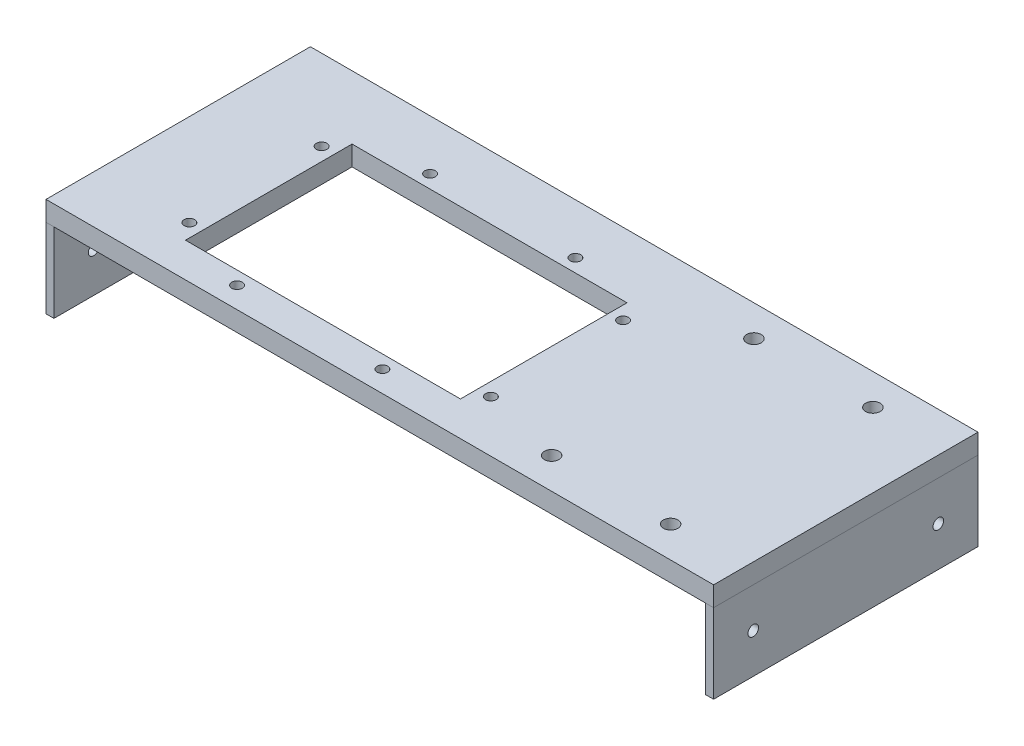
ISO-10303-21;
HEADER;
FILE_DESCRIPTION(('STEP AP214'),'2;1');
FILE_NAME('part.step','',(''),(''),'','','');
FILE_SCHEMA(('AUTOMOTIVE_DESIGN { 1 0 10303 214 1 1 1 1 }'));
ENDSEC;
DATA;
#1=APPLICATION_CONTEXT('core data for automotive mechanical design processes');
#2=APPLICATION_PROTOCOL_DEFINITION('international standard','automotive_design',2000,#1);
#3=PRODUCT_CONTEXT('',#1,'mechanical');
#4=PRODUCT('Part','Part','',(#3));
#5=PRODUCT_RELATED_PRODUCT_CATEGORY('part','',(#4));
#6=PRODUCT_DEFINITION_FORMATION('','',#4);
#7=PRODUCT_DEFINITION_CONTEXT('part definition',#1,'design');
#8=PRODUCT_DEFINITION('design','',#6,#7);
#9=PRODUCT_DEFINITION_SHAPE('','',#8);
#10=(LENGTH_UNIT() NAMED_UNIT(*) SI_UNIT(.MILLI.,.METRE.));
#11=(NAMED_UNIT(*) PLANE_ANGLE_UNIT() SI_UNIT($,.RADIAN.));
#12=(NAMED_UNIT(*) SI_UNIT($,.STERADIAN.) SOLID_ANGLE_UNIT());
#13=UNCERTAINTY_MEASURE_WITH_UNIT(LENGTH_MEASURE(1.E-05),#10,'distance_accuracy_value','');
#14=(GEOMETRIC_REPRESENTATION_CONTEXT(3) GLOBAL_UNCERTAINTY_ASSIGNED_CONTEXT((#13)) GLOBAL_UNIT_ASSIGNED_CONTEXT((#10,
#11,#12)) REPRESENTATION_CONTEXT('',''));
#15=CARTESIAN_POINT('',(0.,0.,0.));
#16=DIRECTION('',(0.,0.,1.));
#17=DIRECTION('',(1.,0.,0.));
#18=AXIS2_PLACEMENT_3D('',#15,#16,#17);
#19=CARTESIAN_POINT('',(252.5,-14.9999999999999,-100.000000000001));
#20=DIRECTION('',(0.,1.,0.));
#21=DIRECTION('',(-1.,0.,0.));
#22=AXIS2_PLACEMENT_3D('',#19,#20,#21);
#23=PLANE('',#22);
#24=DIRECTION('',(-1.,0.,0.));
#25=VECTOR('',#24,1.);
#26=CARTESIAN_POINT('',(252.5,-14.9999999999999,100.000000000001));
#27=LINE('',#26,#25);
#28=CARTESIAN_POINT('',(252.5,-14.9999999999999,100.000000000001));
#29=VERTEX_POINT('',#28);
#30=CARTESIAN_POINT('',(246.5,-14.9999999999999,100.000000000001));
#31=VERTEX_POINT('',#30);
#32=EDGE_CURVE('E113',#29,#31,#27,.T.);
#33=ORIENTED_EDGE('',*,*,#32,.F.);
#34=DIRECTION('',(0.,0.,1.));
#35=VECTOR('',#34,1.);
#36=CARTESIAN_POINT('',(252.5,-14.9999999999999,-100.000000000001));
#37=LINE('',#36,#35);
#38=CARTESIAN_POINT('',(252.5,-14.9999999999999,-100.000000000001));
#39=VERTEX_POINT('',#38);
#40=EDGE_CURVE('E12',#39,#29,#37,.T.);
#41=ORIENTED_EDGE('',*,*,#40,.F.);
#42=DIRECTION('',(-1.,0.,0.));
#43=VECTOR('',#42,1.);
#44=CARTESIAN_POINT('',(252.5,-14.9999999999999,-100.000000000001));
#45=LINE('',#44,#43);
#46=CARTESIAN_POINT('',(246.5,-14.9999999999999,-100.000000000001));
#47=VERTEX_POINT('',#46);
#48=EDGE_CURVE('E106',#39,#47,#45,.T.);
#49=ORIENTED_EDGE('',*,*,#48,.T.);
#50=DIRECTION('',(0.,0.,1.));
#51=VECTOR('',#50,1.);
#52=CARTESIAN_POINT('',(246.5,-14.9999999999999,-100.000000000001));
#53=LINE('',#52,#51);
#54=EDGE_CURVE('E89',#47,#31,#53,.T.);
#55=ORIENTED_EDGE('',*,*,#54,.T.);
#56=EDGE_LOOP('',(#33,#41,#49,#55));
#57=FACE_BOUND('',#56,.T.);
#58=ADVANCED_FACE('F46',(#57),#23,.T.);
#59=CARTESIAN_POINT('',(252.5,-14.9999999999999,-100.000000000001));
#60=DIRECTION('',(1.,0.,0.));
#61=DIRECTION('',(0.,0.,-1.));
#62=AXIS2_PLACEMENT_3D('',#59,#60,#61);
#63=PLANE('',#62);
#64=CARTESIAN_POINT('',(252.5,-45.,70.0000000000006));
#65=DIRECTION('',(-1.,0.,0.));
#66=DIRECTION('',(0.,0.,1.));
#67=AXIS2_PLACEMENT_3D('',#64,#65,#66);
#68=CIRCLE('',#67,4.00000000000001);
#69=CARTESIAN_POINT('',(252.5,-45.,74.0000000000007));
#70=VERTEX_POINT('',#69);
#71=EDGE_CURVE('E124',#70,#70,#68,.T.);
#72=ORIENTED_EDGE('',*,*,#71,.T.);
#73=EDGE_LOOP('',(#72));
#74=FACE_BOUND('',#73,.T.);
#75=CARTESIAN_POINT('',(252.5,-45.,-70.0000000000006));
#76=DIRECTION('',(-1.,0.,0.));
#77=DIRECTION('',(0.,0.,-1.));
#78=AXIS2_PLACEMENT_3D('',#75,#76,#77);
#79=CIRCLE('',#78,4.00000000000001);
#80=CARTESIAN_POINT('',(252.5,-45.,-74.0000000000007));
#81=VERTEX_POINT('',#80);
#82=EDGE_CURVE('E129',#81,#81,#79,.T.);
#83=ORIENTED_EDGE('',*,*,#82,.T.);
#84=EDGE_LOOP('',(#83));
#85=FACE_BOUND('',#84,.T.);
#86=DIRECTION('',(0.,1.,0.));
#87=VECTOR('',#86,1.);
#88=CARTESIAN_POINT('',(252.5,-14.9999999999999,100.000000000001));
#89=LINE('',#88,#87);
#90=CARTESIAN_POINT('',(252.5,-74.9999999999999,100.000000000001));
#91=VERTEX_POINT('',#90);
#92=EDGE_CURVE('E108',#91,#29,#89,.T.);
#93=ORIENTED_EDGE('',*,*,#92,.F.);
#94=DIRECTION('',(0.,0.,1.));
#95=VECTOR('',#94,1.);
#96=CARTESIAN_POINT('',(252.5,-74.9999999999999,-100.000000000001));
#97=LINE('',#96,#95);
#98=CARTESIAN_POINT('',(252.5,-74.9999999999999,-100.000000000001));
#99=VERTEX_POINT('',#98);
#100=EDGE_CURVE('E55',#99,#91,#97,.T.);
#101=ORIENTED_EDGE('',*,*,#100,.F.);
#102=DIRECTION('',(0.,1.,0.));
#103=VECTOR('',#102,1.);
#104=CARTESIAN_POINT('',(252.5,-14.9999999999999,-100.000000000001));
#105=LINE('',#104,#103);
#106=EDGE_CURVE('E103',#99,#39,#105,.T.);
#107=ORIENTED_EDGE('',*,*,#106,.T.);
#108=ORIENTED_EDGE('',*,*,#40,.T.);
#109=EDGE_LOOP('',(#93,#101,#107,#108));
#110=FACE_BOUND('',#109,.T.);
#111=ADVANCED_FACE('F136',(#74,#85,#110),#63,.T.);
#112=CARTESIAN_POINT('',(252.5,-74.9999999999999,-100.000000000001));
#113=DIRECTION('',(0.,-1.,0.));
#114=DIRECTION('',(1.,0.,0.));
#115=AXIS2_PLACEMENT_3D('',#112,#113,#114);
#116=PLANE('',#115);
#117=DIRECTION('',(1.,0.,0.));
#118=VECTOR('',#117,1.);
#119=CARTESIAN_POINT('',(252.5,-74.9999999999999,100.000000000001));
#120=LINE('',#119,#118);
#121=CARTESIAN_POINT('',(246.5,-74.9999999999999,100.000000000001));
#122=VERTEX_POINT('',#121);
#123=EDGE_CURVE('E97',#122,#91,#120,.T.);
#124=ORIENTED_EDGE('',*,*,#123,.F.);
#125=DIRECTION('',(0.,0.,1.));
#126=VECTOR('',#125,1.);
#127=CARTESIAN_POINT('',(246.5,-74.9999999999999,-100.000000000001));
#128=LINE('',#127,#126);
#129=CARTESIAN_POINT('',(246.5,-74.9999999999999,-100.000000000001));
#130=VERTEX_POINT('',#129);
#131=EDGE_CURVE('E92',#130,#122,#128,.T.);
#132=ORIENTED_EDGE('',*,*,#131,.F.);
#133=DIRECTION('',(1.,0.,0.));
#134=VECTOR('',#133,1.);
#135=CARTESIAN_POINT('',(252.5,-74.9999999999999,-100.000000000001));
#136=LINE('',#135,#134);
#137=EDGE_CURVE('E95',#130,#99,#136,.T.);
#138=ORIENTED_EDGE('',*,*,#137,.T.);
#139=ORIENTED_EDGE('',*,*,#100,.T.);
#140=EDGE_LOOP('',(#124,#132,#138,#139));
#141=FACE_BOUND('',#140,.T.);
#142=ADVANCED_FACE('F94',(#141),#116,.T.);
#143=CARTESIAN_POINT('',(246.5,-14.9999999999999,-100.000000000001));
#144=DIRECTION('',(-1.,0.,0.));
#145=DIRECTION('',(0.,0.,1.));
#146=AXIS2_PLACEMENT_3D('',#143,#144,#145);
#147=PLANE('',#146);
#148=CARTESIAN_POINT('',(246.5,-45.,70.0000000000006));
#149=DIRECTION('',(-1.,0.,0.));
#150=DIRECTION('',(0.,0.,1.));
#151=AXIS2_PLACEMENT_3D('',#148,#149,#150);
#152=CIRCLE('',#151,4.00000000000001);
#153=CARTESIAN_POINT('',(246.5,-45.,74.0000000000007));
#154=VERTEX_POINT('',#153);
#155=EDGE_CURVE('E49',#154,#154,#152,.T.);
#156=ORIENTED_EDGE('',*,*,#155,.F.);
#157=EDGE_LOOP('',(#156));
#158=FACE_BOUND('',#157,.T.);
#159=CARTESIAN_POINT('',(246.5,-45.,-70.0000000000006));
#160=DIRECTION('',(-1.,0.,0.));
#161=DIRECTION('',(0.,0.,1.));
#162=AXIS2_PLACEMENT_3D('',#159,#160,#161);
#163=CIRCLE('',#162,4.00000000000001);
#164=CARTESIAN_POINT('',(246.5,-45.,-66.0000000000006));
#165=VERTEX_POINT('',#164);
#166=EDGE_CURVE('E122',#165,#165,#163,.T.);
#167=ORIENTED_EDGE('',*,*,#166,.F.);
#168=EDGE_LOOP('',(#167));
#169=FACE_BOUND('',#168,.T.);
#170=DIRECTION('',(0.,-1.,0.));
#171=VECTOR('',#170,1.);
#172=CARTESIAN_POINT('',(246.5,-14.9999999999999,100.000000000001));
#173=LINE('',#172,#171);
#174=EDGE_CURVE('E116',#31,#122,#173,.T.);
#175=ORIENTED_EDGE('',*,*,#174,.F.);
#176=ORIENTED_EDGE('',*,*,#54,.F.);
#177=DIRECTION('',(0.,-1.,0.));
#178=VECTOR('',#177,1.);
#179=CARTESIAN_POINT('',(246.5,-14.9999999999999,-100.000000000001));
#180=LINE('',#179,#178);
#181=EDGE_CURVE('E102',#47,#130,#180,.T.);
#182=ORIENTED_EDGE('',*,*,#181,.T.);
#183=ORIENTED_EDGE('',*,*,#131,.T.);
#184=EDGE_LOOP('',(#175,#176,#182,#183));
#185=FACE_BOUND('',#184,.T.);
#186=ADVANCED_FACE('F105',(#158,#169,#185),#147,.T.);
#187=CARTESIAN_POINT('',(0.,0.,-100.000000000001));
#188=DIRECTION('',(0.,0.,1.));
#189=DIRECTION('',(1.,0.,0.));
#190=AXIS2_PLACEMENT_3D('',#187,#188,#189);
#191=PLANE('',#190);
#192=ORIENTED_EDGE('',*,*,#48,.F.);
#193=ORIENTED_EDGE('',*,*,#106,.F.);
#194=ORIENTED_EDGE('',*,*,#137,.F.);
#195=ORIENTED_EDGE('',*,*,#181,.F.);
#196=EDGE_LOOP('',(#192,#193,#194,#195));
#197=FACE_BOUND('',#196,.T.);
#198=ADVANCED_FACE('F101',(#197),#191,.F.);
#199=CARTESIAN_POINT('',(0.,0.,100.000000000001));
#200=DIRECTION('',(0.,0.,1.));
#201=DIRECTION('',(1.,0.,0.));
#202=AXIS2_PLACEMENT_3D('',#199,#200,#201);
#203=PLANE('',#202);
#204=ORIENTED_EDGE('',*,*,#32,.T.);
#205=ORIENTED_EDGE('',*,*,#174,.T.);
#206=ORIENTED_EDGE('',*,*,#123,.T.);
#207=ORIENTED_EDGE('',*,*,#92,.T.);
#208=EDGE_LOOP('',(#204,#205,#206,#207));
#209=FACE_BOUND('',#208,.T.);
#210=ADVANCED_FACE('F141',(#209),#203,.T.);
#211=CARTESIAN_POINT('',(252.5,-45.,-70.0000000000006));
#212=DIRECTION('',(-1.,0.,0.));
#213=DIRECTION('',(0.,0.,1.));
#214=AXIS2_PLACEMENT_3D('',#211,#212,#213);
#215=CYLINDRICAL_SURFACE('',#214,4.00000000000001);
#216=ORIENTED_EDGE('',*,*,#166,.T.);
#217=EDGE_LOOP('',(#216));
#218=FACE_BOUND('',#217,.T.);
#219=ORIENTED_EDGE('',*,*,#82,.F.);
#220=EDGE_LOOP('',(#219));
#221=FACE_BOUND('',#220,.T.);
#222=ADVANCED_FACE('F138',(#218,#221),#215,.F.);
#223=CARTESIAN_POINT('',(252.5,-45.,70.0000000000006));
#224=DIRECTION('',(-1.,0.,0.));
#225=DIRECTION('',(0.,0.,1.));
#226=AXIS2_PLACEMENT_3D('',#223,#224,#225);
#227=CYLINDRICAL_SURFACE('',#226,4.00000000000001);
#228=ORIENTED_EDGE('',*,*,#155,.T.);
#229=EDGE_LOOP('',(#228));
#230=FACE_BOUND('',#229,.T.);
#231=ORIENTED_EDGE('',*,*,#71,.F.);
#232=EDGE_LOOP('',(#231));
#233=FACE_BOUND('',#232,.T.);
#234=ADVANCED_FACE('F140',(#230,#233),#227,.F.);
#235=CLOSED_SHELL('',(#58,#111,#142,#186,#198,#210,#222,#234));
#236=MANIFOLD_SOLID_BREP('B2',#235);
#237=CARTESIAN_POINT('',(-252.5,-15.,-100.000000000001));
#238=DIRECTION('',(-1.,0.,0.));
#239=DIRECTION('',(0.,0.,1.));
#240=AXIS2_PLACEMENT_3D('',#237,#238,#239);
#241=PLANE('',#240);
#242=CARTESIAN_POINT('',(-252.5,-45.,70.0000000000006));
#243=DIRECTION('',(-1.,0.,0.));
#244=DIRECTION('',(0.,0.,1.));
#245=AXIS2_PLACEMENT_3D('',#242,#243,#244);
#246=CIRCLE('',#245,4.00000000000001);
#247=CARTESIAN_POINT('',(-252.5,-45.,74.0000000000007));
#248=VERTEX_POINT('',#247);
#249=EDGE_CURVE('E299',#248,#248,#246,.T.);
#250=ORIENTED_EDGE('',*,*,#249,.F.);
#251=EDGE_LOOP('',(#250));
#252=FACE_BOUND('',#251,.T.);
#253=CARTESIAN_POINT('',(-252.5,-45.,-70.0000000000006));
#254=DIRECTION('',(-1.,0.,0.));
#255=DIRECTION('',(0.,0.,-1.));
#256=AXIS2_PLACEMENT_3D('',#253,#254,#255);
#257=CIRCLE('',#256,4.00000000000001);
#258=CARTESIAN_POINT('',(-252.5,-45.,-74.0000000000007));
#259=VERTEX_POINT('',#258);
#260=EDGE_CURVE('E304',#259,#259,#257,.T.);
#261=ORIENTED_EDGE('',*,*,#260,.F.);
#262=EDGE_LOOP('',(#261));
#263=FACE_BOUND('',#262,.T.);
#264=DIRECTION('',(0.,-1.,0.));
#265=VECTOR('',#264,1.);
#266=CARTESIAN_POINT('',(-252.5,-15.,100.000000000001));
#267=LINE('',#266,#265);
#268=CARTESIAN_POINT('',(-252.5,-15.,100.000000000001));
#269=VERTEX_POINT('',#268);
#270=CARTESIAN_POINT('',(-252.5,-75.,100.000000000001));
#271=VERTEX_POINT('',#270);
#272=EDGE_CURVE('E288',#269,#271,#267,.T.);
#273=ORIENTED_EDGE('',*,*,#272,.F.);
#274=DIRECTION('',(0.,0.,1.));
#275=VECTOR('',#274,1.);
#276=CARTESIAN_POINT('',(-252.5,-15.,-100.000000000001));
#277=LINE('',#276,#275);
#278=CARTESIAN_POINT('',(-252.5,-15.,-100.000000000001));
#279=VERTEX_POINT('',#278);
#280=EDGE_CURVE('E44',#279,#269,#277,.T.);
#281=ORIENTED_EDGE('',*,*,#280,.F.);
#282=DIRECTION('',(0.,-1.,0.));
#283=VECTOR('',#282,1.);
#284=CARTESIAN_POINT('',(-252.5,-15.,-100.000000000001));
#285=LINE('',#284,#283);
#286=CARTESIAN_POINT('',(-252.5,-75.,-100.000000000001));
#287=VERTEX_POINT('',#286);
#288=EDGE_CURVE('E281',#279,#287,#285,.T.);
#289=ORIENTED_EDGE('',*,*,#288,.T.);
#290=DIRECTION('',(0.,0.,1.));
#291=VECTOR('',#290,1.);
#292=CARTESIAN_POINT('',(-252.5,-75.,-100.000000000001));
#293=LINE('',#292,#291);
#294=EDGE_CURVE('E264',#287,#271,#293,.T.);
#295=ORIENTED_EDGE('',*,*,#294,.T.);
#296=EDGE_LOOP('',(#273,#281,#289,#295));
#297=FACE_BOUND('',#296,.T.);
#298=ADVANCED_FACE('F221',(#252,#263,#297),#241,.T.);
#299=CARTESIAN_POINT('',(-252.5,-15.,-100.000000000001));
#300=DIRECTION('',(0.,1.,0.));
#301=DIRECTION('',(0.,0.,1.));
#302=AXIS2_PLACEMENT_3D('',#299,#300,#301);
#303=PLANE('',#302);
#304=DIRECTION('',(-1.,0.,0.));
#305=VECTOR('',#304,1.);
#306=CARTESIAN_POINT('',(-252.5,-15.,100.000000000001));
#307=LINE('',#306,#305);
#308=CARTESIAN_POINT('',(-246.5,-15.,100.000000000001));
#309=VERTEX_POINT('',#308);
#310=EDGE_CURVE('E283',#309,#269,#307,.T.);
#311=ORIENTED_EDGE('',*,*,#310,.F.);
#312=DIRECTION('',(0.,0.,1.));
#313=VECTOR('',#312,1.);
#314=CARTESIAN_POINT('',(-246.5,-15.,-100.000000000001));
#315=LINE('',#314,#313);
#316=CARTESIAN_POINT('',(-246.5,-15.,-100.000000000001));
#317=VERTEX_POINT('',#316);
#318=EDGE_CURVE('E230',#317,#309,#315,.T.);
#319=ORIENTED_EDGE('',*,*,#318,.F.);
#320=DIRECTION('',(-1.,0.,0.));
#321=VECTOR('',#320,1.);
#322=CARTESIAN_POINT('',(-252.5,-15.,-100.000000000001));
#323=LINE('',#322,#321);
#324=EDGE_CURVE('E278',#317,#279,#323,.T.);
#325=ORIENTED_EDGE('',*,*,#324,.T.);
#326=ORIENTED_EDGE('',*,*,#280,.T.);
#327=EDGE_LOOP('',(#311,#319,#325,#326));
#328=FACE_BOUND('',#327,.T.);
#329=ADVANCED_FACE('F314',(#328),#303,.T.);
#330=CARTESIAN_POINT('',(-246.5,-15.,-100.000000000001));
#331=DIRECTION('',(1.,0.,0.));
#332=DIRECTION('',(0.,0.,-1.));
#333=AXIS2_PLACEMENT_3D('',#330,#331,#332);
#334=PLANE('',#333);
#335=CARTESIAN_POINT('',(-246.5,-45.,70.0000000000006));
#336=DIRECTION('',(1.,0.,0.));
#337=DIRECTION('',(0.,0.,-1.));
#338=AXIS2_PLACEMENT_3D('',#335,#336,#337);
#339=CIRCLE('',#338,4.00000000000001);
#340=CARTESIAN_POINT('',(-246.5,-45.,66.0000000000006));
#341=VERTEX_POINT('',#340);
#342=EDGE_CURVE('E224',#341,#341,#339,.T.);
#343=ORIENTED_EDGE('',*,*,#342,.F.);
#344=EDGE_LOOP('',(#343));
#345=FACE_BOUND('',#344,.T.);
#346=CARTESIAN_POINT('',(-246.5,-45.,-70.0000000000006));
#347=DIRECTION('',(1.,0.,0.));
#348=DIRECTION('',(0.,0.,-1.));
#349=AXIS2_PLACEMENT_3D('',#346,#347,#348);
#350=CIRCLE('',#349,4.00000000000001);
#351=CARTESIAN_POINT('',(-246.5,-45.,-74.0000000000007));
#352=VERTEX_POINT('',#351);
#353=EDGE_CURVE('E297',#352,#352,#350,.T.);
#354=ORIENTED_EDGE('',*,*,#353,.F.);
#355=EDGE_LOOP('',(#354));
#356=FACE_BOUND('',#355,.T.);
#357=DIRECTION('',(0.,1.,0.));
#358=VECTOR('',#357,1.);
#359=CARTESIAN_POINT('',(-246.5,-15.,100.000000000001));
#360=LINE('',#359,#358);
#361=CARTESIAN_POINT('',(-246.5,-75.,100.000000000001));
#362=VERTEX_POINT('',#361);
#363=EDGE_CURVE('E272',#362,#309,#360,.T.);
#364=ORIENTED_EDGE('',*,*,#363,.F.);
#365=DIRECTION('',(0.,0.,1.));
#366=VECTOR('',#365,1.);
#367=CARTESIAN_POINT('',(-246.5,-75.,-100.000000000001));
#368=LINE('',#367,#366);
#369=CARTESIAN_POINT('',(-246.5,-75.,-100.000000000001));
#370=VERTEX_POINT('',#369);
#371=EDGE_CURVE('E267',#370,#362,#368,.T.);
#372=ORIENTED_EDGE('',*,*,#371,.F.);
#373=DIRECTION('',(0.,1.,0.));
#374=VECTOR('',#373,1.);
#375=CARTESIAN_POINT('',(-246.5,-15.,-100.000000000001));
#376=LINE('',#375,#374);
#377=EDGE_CURVE('E270',#370,#317,#376,.T.);
#378=ORIENTED_EDGE('',*,*,#377,.T.);
#379=ORIENTED_EDGE('',*,*,#318,.T.);
#380=EDGE_LOOP('',(#364,#372,#378,#379));
#381=FACE_BOUND('',#380,.T.);
#382=ADVANCED_FACE('F269',(#345,#356,#381),#334,.T.);
#383=CARTESIAN_POINT('',(-252.5,-75.,-100.000000000001));
#384=DIRECTION('',(0.,-1.,0.));
#385=DIRECTION('',(0.,0.,-1.));
#386=AXIS2_PLACEMENT_3D('',#383,#384,#385);
#387=PLANE('',#386);
#388=DIRECTION('',(1.,0.,0.));
#389=VECTOR('',#388,1.);
#390=CARTESIAN_POINT('',(-252.5,-75.,100.000000000001));
#391=LINE('',#390,#389);
#392=EDGE_CURVE('E291',#271,#362,#391,.T.);
#393=ORIENTED_EDGE('',*,*,#392,.F.);
#394=ORIENTED_EDGE('',*,*,#294,.F.);
#395=DIRECTION('',(1.,0.,0.));
#396=VECTOR('',#395,1.);
#397=CARTESIAN_POINT('',(-252.5,-75.,-100.000000000001));
#398=LINE('',#397,#396);
#399=EDGE_CURVE('E277',#287,#370,#398,.T.);
#400=ORIENTED_EDGE('',*,*,#399,.T.);
#401=ORIENTED_EDGE('',*,*,#371,.T.);
#402=EDGE_LOOP('',(#393,#394,#400,#401));
#403=FACE_BOUND('',#402,.T.);
#404=ADVANCED_FACE('F280',(#403),#387,.T.);
#405=CARTESIAN_POINT('',(0.,0.,-100.000000000001));
#406=DIRECTION('',(0.,0.,1.));
#407=DIRECTION('',(1.,0.,0.));
#408=AXIS2_PLACEMENT_3D('',#405,#406,#407);
#409=PLANE('',#408);
#410=ORIENTED_EDGE('',*,*,#288,.F.);
#411=ORIENTED_EDGE('',*,*,#324,.F.);
#412=ORIENTED_EDGE('',*,*,#377,.F.);
#413=ORIENTED_EDGE('',*,*,#399,.F.);
#414=EDGE_LOOP('',(#410,#411,#412,#413));
#415=FACE_BOUND('',#414,.T.);
#416=ADVANCED_FACE('F276',(#415),#409,.F.);
#417=CARTESIAN_POINT('',(0.,0.,100.000000000001));
#418=DIRECTION('',(0.,0.,1.));
#419=DIRECTION('',(1.,0.,0.));
#420=AXIS2_PLACEMENT_3D('',#417,#418,#419);
#421=PLANE('',#420);
#422=ORIENTED_EDGE('',*,*,#272,.T.);
#423=ORIENTED_EDGE('',*,*,#392,.T.);
#424=ORIENTED_EDGE('',*,*,#363,.T.);
#425=ORIENTED_EDGE('',*,*,#310,.T.);
#426=EDGE_LOOP('',(#422,#423,#424,#425));
#427=FACE_BOUND('',#426,.T.);
#428=ADVANCED_FACE('F317',(#427),#421,.T.);
#429=CARTESIAN_POINT('',(252.5,-45.,-70.0000000000006));
#430=DIRECTION('',(-1.,0.,0.));
#431=DIRECTION('',(0.,0.,1.));
#432=AXIS2_PLACEMENT_3D('',#429,#430,#431);
#433=CYLINDRICAL_SURFACE('',#432,4.00000000000001);
#434=ORIENTED_EDGE('',*,*,#353,.T.);
#435=EDGE_LOOP('',(#434));
#436=FACE_BOUND('',#435,.T.);
#437=ORIENTED_EDGE('',*,*,#260,.T.);
#438=EDGE_LOOP('',(#437));
#439=FACE_BOUND('',#438,.T.);
#440=ADVANCED_FACE('F311',(#436,#439),#433,.F.);
#441=CARTESIAN_POINT('',(252.5,-45.,70.0000000000006));
#442=DIRECTION('',(-1.,0.,0.));
#443=DIRECTION('',(0.,0.,1.));
#444=AXIS2_PLACEMENT_3D('',#441,#442,#443);
#445=CYLINDRICAL_SURFACE('',#444,4.00000000000001);
#446=ORIENTED_EDGE('',*,*,#342,.T.);
#447=EDGE_LOOP('',(#446));
#448=FACE_BOUND('',#447,.T.);
#449=ORIENTED_EDGE('',*,*,#249,.T.);
#450=EDGE_LOOP('',(#449));
#451=FACE_BOUND('',#450,.T.);
#452=ADVANCED_FACE('F337',(#448,#451),#445,.F.);
#453=CLOSED_SHELL('',(#298,#329,#382,#404,#416,#428,#440,#452));
#454=MANIFOLD_SOLID_BREP('B6',#453);
#455=CARTESIAN_POINT('',(252.5,-15.,100.000000000001));
#456=DIRECTION('',(1.,0.,0.));
#457=DIRECTION('',(0.,0.,-1.));
#458=AXIS2_PLACEMENT_3D('',#455,#456,#457);
#459=PLANE('',#458);
#460=DIRECTION('',(0.,0.,-1.));
#461=VECTOR('',#460,1.);
#462=CARTESIAN_POINT('',(252.5,0.,100.000000000001));
#463=LINE('',#462,#461);
#464=CARTESIAN_POINT('',(252.5,0.,100.000000000001));
#465=VERTEX_POINT('',#464);
#466=CARTESIAN_POINT('',(252.5,0.,-100.000000000001));
#467=VERTEX_POINT('',#466);
#468=EDGE_CURVE('E558',#465,#467,#463,.T.);
#469=ORIENTED_EDGE('',*,*,#468,.F.);
#470=DIRECTION('',(0.,1.,0.));
#471=VECTOR('',#470,1.);
#472=CARTESIAN_POINT('',(252.5,-15.,100.000000000001));
#473=LINE('',#472,#471);
#474=CARTESIAN_POINT('',(252.5,-15.,100.000000000001));
#475=VERTEX_POINT('',#474);
#476=EDGE_CURVE('E219',#475,#465,#473,.T.);
#477=ORIENTED_EDGE('',*,*,#476,.F.);
#478=DIRECTION('',(0.,0.,-1.));
#479=VECTOR('',#478,1.);
#480=CARTESIAN_POINT('',(252.5,-15.,100.000000000001));
#481=LINE('',#480,#479);
#482=CARTESIAN_POINT('',(252.5,-15.,-100.000000000001));
#483=VERTEX_POINT('',#482);
#484=EDGE_CURVE('E561',#475,#483,#481,.T.);
#485=ORIENTED_EDGE('',*,*,#484,.T.);
#486=DIRECTION('',(0.,1.,0.));
#487=VECTOR('',#486,1.);
#488=CARTESIAN_POINT('',(252.5,-15.,-100.000000000001));
#489=LINE('',#488,#487);
#490=EDGE_CURVE('E390',#483,#467,#489,.T.);
#491=ORIENTED_EDGE('',*,*,#490,.T.);
#492=EDGE_LOOP('',(#469,#477,#485,#491));
#493=FACE_BOUND('',#492,.T.);
#494=ADVANCED_FACE('F387',(#493),#459,.T.);
#495=CARTESIAN_POINT('',(-252.5,-15.,100.000000000001));
#496=DIRECTION('',(0.,0.,1.));
#497=DIRECTION('',(1.,0.,0.));
#498=AXIS2_PLACEMENT_3D('',#495,#496,#497);
#499=PLANE('',#498);
#500=DIRECTION('',(1.,0.,0.));
#501=VECTOR('',#500,1.);
#502=CARTESIAN_POINT('',(-252.5,0.,100.000000000001));
#503=LINE('',#502,#501);
#504=CARTESIAN_POINT('',(-252.5,0.,100.000000000001));
#505=VERTEX_POINT('',#504);
#506=EDGE_CURVE('E565',#505,#465,#503,.T.);
#507=ORIENTED_EDGE('',*,*,#506,.F.);
#508=DIRECTION('',(0.,1.,0.));
#509=VECTOR('',#508,1.);
#510=CARTESIAN_POINT('',(-252.5,-15.,100.000000000001));
#511=LINE('',#510,#509);
#512=CARTESIAN_POINT('',(-252.5,-15.,100.000000000001));
#513=VERTEX_POINT('',#512);
#514=EDGE_CURVE('E395',#513,#505,#511,.T.);
#515=ORIENTED_EDGE('',*,*,#514,.F.);
#516=DIRECTION('',(1.,0.,0.));
#517=VECTOR('',#516,1.);
#518=CARTESIAN_POINT('',(-252.5,-15.,100.000000000001));
#519=LINE('',#518,#517);
#520=EDGE_CURVE('E571',#513,#475,#519,.T.);
#521=ORIENTED_EDGE('',*,*,#520,.T.);
#522=ORIENTED_EDGE('',*,*,#476,.T.);
#523=EDGE_LOOP('',(#507,#515,#521,#522));
#524=FACE_BOUND('',#523,.T.);
#525=ADVANCED_FACE('F596',(#524),#499,.T.);
#526=CARTESIAN_POINT('',(-252.5,-15.,-100.000000000001));
#527=DIRECTION('',(-1.,0.,0.));
#528=DIRECTION('',(0.,0.,1.));
#529=AXIS2_PLACEMENT_3D('',#526,#527,#528);
#530=PLANE('',#529);
#531=DIRECTION('',(0.,0.,1.));
#532=VECTOR('',#531,1.);
#533=CARTESIAN_POINT('',(-252.5,0.,-100.000000000001));
#534=LINE('',#533,#532);
#535=CARTESIAN_POINT('',(-252.5,0.,-100.000000000001));
#536=VERTEX_POINT('',#535);
#537=EDGE_CURVE('E579',#536,#505,#534,.T.);
#538=ORIENTED_EDGE('',*,*,#537,.F.);
#539=DIRECTION('',(0.,1.,0.));
#540=VECTOR('',#539,1.);
#541=CARTESIAN_POINT('',(-252.5,-15.,-100.000000000001));
#542=LINE('',#541,#540);
#543=CARTESIAN_POINT('',(-252.5,-15.,-100.000000000001));
#544=VERTEX_POINT('',#543);
#545=EDGE_CURVE('E584',#544,#536,#542,.T.);
#546=ORIENTED_EDGE('',*,*,#545,.F.);
#547=DIRECTION('',(0.,0.,1.));
#548=VECTOR('',#547,1.);
#549=CARTESIAN_POINT('',(-252.5,-15.,-100.000000000001));
#550=LINE('',#549,#548);
#551=EDGE_CURVE('E568',#544,#513,#550,.T.);
#552=ORIENTED_EDGE('',*,*,#551,.T.);
#553=ORIENTED_EDGE('',*,*,#514,.T.);
#554=EDGE_LOOP('',(#538,#546,#552,#553));
#555=FACE_BOUND('',#554,.T.);
#556=ADVANCED_FACE('F602',(#555),#530,.T.);
#557=CARTESIAN_POINT('',(252.5,-15.,-100.000000000001));
#558=DIRECTION('',(0.,0.,-1.));
#559=DIRECTION('',(-1.,0.,0.));
#560=AXIS2_PLACEMENT_3D('',#557,#558,#559);
#561=PLANE('',#560);
#562=DIRECTION('',(-1.,0.,0.));
#563=VECTOR('',#562,1.);
#564=CARTESIAN_POINT('',(252.5,0.,-100.000000000001));
#565=LINE('',#564,#563);
#566=EDGE_CURVE('E576',#467,#536,#565,.T.);
#567=ORIENTED_EDGE('',*,*,#566,.F.);
#568=ORIENTED_EDGE('',*,*,#490,.F.);
#569=DIRECTION('',(-1.,0.,0.));
#570=VECTOR('',#569,1.);
#571=CARTESIAN_POINT('',(252.5,-15.,-100.000000000001));
#572=LINE('',#571,#570);
#573=EDGE_CURVE('E564',#483,#544,#572,.T.);
#574=ORIENTED_EDGE('',*,*,#573,.T.);
#575=ORIENTED_EDGE('',*,*,#545,.T.);
#576=EDGE_LOOP('',(#567,#568,#574,#575));
#577=FACE_BOUND('',#576,.T.);
#578=ADVANCED_FACE('F592',(#577),#561,.T.);
#579=CARTESIAN_POINT('',(0.,-15.,0.));
#580=DIRECTION('',(0.,1.,0.));
#581=DIRECTION('',(0.,0.,1.));
#582=AXIS2_PLACEMENT_3D('',#579,#580,#581);
#583=PLANE('',#582);
#584=DIRECTION('',(1.,0.,0.));
#585=VECTOR('',#584,1.);
#586=CARTESIAN_POINT('',(-173.,-15.,-52.));
#587=LINE('',#586,#585);
#588=CARTESIAN_POINT('',(-173.,-15.,-52.));
#589=VERTEX_POINT('',#588);
#590=CARTESIAN_POINT('',(35.0000000000001,-15.,-52.0000000000001));
#591=VERTEX_POINT('',#590);
#592=EDGE_CURVE('E479',#589,#591,#587,.T.);
#593=ORIENTED_EDGE('',*,*,#592,.F.);
#594=DIRECTION('',(0.,0.,-1.));
#595=VECTOR('',#594,1.);
#596=CARTESIAN_POINT('',(-173.,-15.,74.0000000000002));
#597=LINE('',#596,#595);
#598=CARTESIAN_POINT('',(-173.,-15.,74.0000000000002));
#599=VERTEX_POINT('',#598);
#600=EDGE_CURVE('E403',#599,#589,#597,.T.);
#601=ORIENTED_EDGE('',*,*,#600,.F.);
#602=DIRECTION('',(-1.,0.,0.));
#603=VECTOR('',#602,1.);
#604=CARTESIAN_POINT('',(-173.,-15.,74.0000000000002));
#605=LINE('',#604,#603);
#606=CARTESIAN_POINT('',(35.0000000000001,-15.,74.0000000000002));
#607=VERTEX_POINT('',#606);
#608=EDGE_CURVE('E470',#607,#599,#605,.T.);
#609=ORIENTED_EDGE('',*,*,#608,.F.);
#610=DIRECTION('',(0.,0.,1.));
#611=VECTOR('',#610,1.);
#612=CARTESIAN_POINT('',(35.0000000000001,-15.,74.0000000000002));
#613=LINE('',#612,#611);
#614=EDGE_CURVE('E473',#591,#607,#613,.T.);
#615=ORIENTED_EDGE('',*,*,#614,.F.);
#616=EDGE_LOOP('',(#593,#601,#609,#615));
#617=FACE_BOUND('',#616,.T.);
#618=CARTESIAN_POINT('',(-13.9999999999999,-15.,-62.));
#619=DIRECTION('',(0.,1.,0.));
#620=DIRECTION('',(0.,0.,1.));
#621=AXIS2_PLACEMENT_3D('',#618,#619,#620);
#622=CIRCLE('',#621,4.);
#623=CARTESIAN_POINT('',(-13.9999999999999,-15.,-58.));
#624=VERTEX_POINT('',#623);
#625=EDGE_CURVE('E489',#624,#624,#622,.T.);
#626=ORIENTED_EDGE('',*,*,#625,.T.);
#627=EDGE_LOOP('',(#626));
#628=FACE_BOUND('',#627,.T.);
#629=CARTESIAN_POINT('',(45.0000000000001,-15.,-39.));
#630=DIRECTION('',(0.,1.,0.));
#631=DIRECTION('',(0.,0.,1.));
#632=AXIS2_PLACEMENT_3D('',#629,#630,#631);
#633=CIRCLE('',#632,4.00000000000001);
#634=CARTESIAN_POINT('',(45.0000000000001,-15.,-35.));
#635=VERTEX_POINT('',#634);
#636=EDGE_CURVE('E495',#635,#635,#633,.T.);
#637=ORIENTED_EDGE('',*,*,#636,.T.);
#638=EDGE_LOOP('',(#637));
#639=FACE_BOUND('',#638,.T.);
#640=CARTESIAN_POINT('',(-124.,-15.,-62.));
#641=DIRECTION('',(0.,1.,0.));
#642=DIRECTION('',(0.,0.,1.));
#643=AXIS2_PLACEMENT_3D('',#640,#641,#642);
#644=CIRCLE('',#643,4.00000000000001);
#645=CARTESIAN_POINT('',(-124.,-15.,-58.));
#646=VERTEX_POINT('',#645);
#647=EDGE_CURVE('E501',#646,#646,#644,.T.);
#648=ORIENTED_EDGE('',*,*,#647,.T.);
#649=EDGE_LOOP('',(#648));
#650=FACE_BOUND('',#649,.T.);
#651=CARTESIAN_POINT('',(-183.,-15.,-39.));
#652=DIRECTION('',(0.,1.,0.));
#653=DIRECTION('',(0.,0.,1.));
#654=AXIS2_PLACEMENT_3D('',#651,#652,#653);
#655=CIRCLE('',#654,3.99999999999999);
#656=CARTESIAN_POINT('',(-183.,-15.,-35.));
#657=VERTEX_POINT('',#656);
#658=EDGE_CURVE('E507',#657,#657,#655,.T.);
#659=ORIENTED_EDGE('',*,*,#658,.T.);
#660=EDGE_LOOP('',(#659));
#661=FACE_BOUND('',#660,.T.);
#662=CARTESIAN_POINT('',(-183.,-15.,61.));
#663=DIRECTION('',(0.,1.,0.));
#664=DIRECTION('',(0.,0.,1.));
#665=AXIS2_PLACEMENT_3D('',#662,#663,#664);
#666=CIRCLE('',#665,3.99999999999999);
#667=CARTESIAN_POINT('',(-183.,-15.,65.));
#668=VERTEX_POINT('',#667);
#669=EDGE_CURVE('E513',#668,#668,#666,.T.);
#670=ORIENTED_EDGE('',*,*,#669,.T.);
#671=EDGE_LOOP('',(#670));
#672=FACE_BOUND('',#671,.T.);
#673=CARTESIAN_POINT('',(-124.,-15.,84.0000000000001));
#674=DIRECTION('',(0.,1.,0.));
#675=DIRECTION('',(0.,0.,1.));
#676=AXIS2_PLACEMENT_3D('',#673,#674,#675);
#677=CIRCLE('',#676,4.00000000000001);
#678=CARTESIAN_POINT('',(-124.,-15.,88.0000000000001));
#679=VERTEX_POINT('',#678);
#680=EDGE_CURVE('E519',#679,#679,#677,.T.);
#681=ORIENTED_EDGE('',*,*,#680,.T.);
#682=EDGE_LOOP('',(#681));
#683=FACE_BOUND('',#682,.T.);
#684=CARTESIAN_POINT('',(106.5,-15.,-76.5));
#685=DIRECTION('',(0.,1.,0.));
#686=DIRECTION('',(0.,0.,1.));
#687=AXIS2_PLACEMENT_3D('',#684,#685,#686);
#688=CIRCLE('',#687,5.5);
#689=CARTESIAN_POINT('',(106.5,-15.,-71.));
#690=VERTEX_POINT('',#689);
#691=EDGE_CURVE('E525',#690,#690,#688,.T.);
#692=ORIENTED_EDGE('',*,*,#691,.T.);
#693=EDGE_LOOP('',(#692));
#694=FACE_BOUND('',#693,.T.);
#695=CARTESIAN_POINT('',(196.5,-15.,-76.5));
#696=DIRECTION('',(0.,1.,0.));
#697=DIRECTION('',(0.,0.,1.));
#698=AXIS2_PLACEMENT_3D('',#695,#696,#697);
#699=CIRCLE('',#698,5.5);
#700=CARTESIAN_POINT('',(196.5,-15.,-71.));
#701=VERTEX_POINT('',#700);
#702=EDGE_CURVE('E531',#701,#701,#699,.T.);
#703=ORIENTED_EDGE('',*,*,#702,.T.);
#704=EDGE_LOOP('',(#703));
#705=FACE_BOUND('',#704,.T.);
#706=CARTESIAN_POINT('',(196.5,-15.,76.5));
#707=DIRECTION('',(0.,1.,0.));
#708=DIRECTION('',(0.,0.,1.));
#709=AXIS2_PLACEMENT_3D('',#706,#707,#708);
#710=CIRCLE('',#709,5.5);
#711=CARTESIAN_POINT('',(196.5,-15.,82.));
#712=VERTEX_POINT('',#711);
#713=EDGE_CURVE('E537',#712,#712,#710,.T.);
#714=ORIENTED_EDGE('',*,*,#713,.T.);
#715=EDGE_LOOP('',(#714));
#716=FACE_BOUND('',#715,.T.);
#717=CARTESIAN_POINT('',(106.5,-15.,76.5));
#718=DIRECTION('',(0.,1.,0.));
#719=DIRECTION('',(0.,0.,1.));
#720=AXIS2_PLACEMENT_3D('',#717,#718,#719);
#721=CIRCLE('',#720,5.5);
#722=CARTESIAN_POINT('',(106.5,-15.,82.));
#723=VERTEX_POINT('',#722);
#724=EDGE_CURVE('E543',#723,#723,#721,.T.);
#725=ORIENTED_EDGE('',*,*,#724,.T.);
#726=EDGE_LOOP('',(#725));
#727=FACE_BOUND('',#726,.T.);
#728=CARTESIAN_POINT('',(-13.9999999999999,-15.,84.0000000000001));
#729=DIRECTION('',(0.,1.,0.));
#730=DIRECTION('',(0.,0.,1.));
#731=AXIS2_PLACEMENT_3D('',#728,#729,#730);
#732=CIRCLE('',#731,4.);
#733=CARTESIAN_POINT('',(-13.9999999999999,-15.,88.0000000000001));
#734=VERTEX_POINT('',#733);
#735=EDGE_CURVE('E549',#734,#734,#732,.T.);
#736=ORIENTED_EDGE('',*,*,#735,.T.);
#737=EDGE_LOOP('',(#736));
#738=FACE_BOUND('',#737,.T.);
#739=CARTESIAN_POINT('',(45.0000000000001,-15.,61.));
#740=DIRECTION('',(0.,1.,0.));
#741=DIRECTION('',(0.,0.,1.));
#742=AXIS2_PLACEMENT_3D('',#739,#740,#741);
#743=CIRCLE('',#742,4.00000000000001);
#744=CARTESIAN_POINT('',(45.0000000000001,-15.,65.));
#745=VERTEX_POINT('',#744);
#746=EDGE_CURVE('E555',#745,#745,#743,.T.);
#747=ORIENTED_EDGE('',*,*,#746,.T.);
#748=EDGE_LOOP('',(#747));
#749=FACE_BOUND('',#748,.T.);
#750=ORIENTED_EDGE('',*,*,#484,.F.);
#751=ORIENTED_EDGE('',*,*,#520,.F.);
#752=ORIENTED_EDGE('',*,*,#551,.F.);
#753=ORIENTED_EDGE('',*,*,#573,.F.);
#754=EDGE_LOOP('',(#750,#751,#752,#753));
#755=FACE_BOUND('',#754,.T.);
#756=ADVANCED_FACE('F599',(#617,#628,#639,#650,#661,#672,#683,#694,#705,#716,#727,#738,#749,
#755),#583,.F.);
#757=CARTESIAN_POINT('',(0.,0.,0.));
#758=DIRECTION('',(0.,1.,0.));
#759=DIRECTION('',(0.,0.,1.));
#760=AXIS2_PLACEMENT_3D('',#757,#758,#759);
#761=PLANE('',#760);
#762=DIRECTION('',(0.,0.,-1.));
#763=VECTOR('',#762,1.);
#764=CARTESIAN_POINT('',(-173.,0.,74.0000000000002));
#765=LINE('',#764,#763);
#766=CARTESIAN_POINT('',(-173.,0.,74.0000000000002));
#767=VERTEX_POINT('',#766);
#768=CARTESIAN_POINT('',(-173.,0.,-52.));
#769=VERTEX_POINT('',#768);
#770=EDGE_CURVE('E454',#767,#769,#765,.T.);
#771=ORIENTED_EDGE('',*,*,#770,.T.);
#772=DIRECTION('',(1.,0.,0.));
#773=VECTOR('',#772,1.);
#774=CARTESIAN_POINT('',(-173.,0.,-52.));
#775=LINE('',#774,#773);
#776=CARTESIAN_POINT('',(35.0000000000001,0.,-52.0000000000001));
#777=VERTEX_POINT('',#776);
#778=EDGE_CURVE('E463',#769,#777,#775,.T.);
#779=ORIENTED_EDGE('',*,*,#778,.T.);
#780=DIRECTION('',(0.,0.,1.));
#781=VECTOR('',#780,1.);
#782=CARTESIAN_POINT('',(35.0000000000001,0.,74.0000000000002));
#783=LINE('',#782,#781);
#784=CARTESIAN_POINT('',(35.0000000000001,0.,74.0000000000002));
#785=VERTEX_POINT('',#784);
#786=EDGE_CURVE('E411',#777,#785,#783,.T.);
#787=ORIENTED_EDGE('',*,*,#786,.T.);
#788=DIRECTION('',(-1.,0.,0.));
#789=VECTOR('',#788,1.);
#790=CARTESIAN_POINT('',(-173.,0.,74.0000000000002));
#791=LINE('',#790,#789);
#792=EDGE_CURVE('E460',#785,#767,#791,.T.);
#793=ORIENTED_EDGE('',*,*,#792,.T.);
#794=EDGE_LOOP('',(#771,#779,#787,#793));
#795=FACE_BOUND('',#794,.T.);
#796=CARTESIAN_POINT('',(-13.9999999999999,0.,-62.));
#797=DIRECTION('',(0.,1.,0.));
#798=DIRECTION('',(0.,0.,1.));
#799=AXIS2_PLACEMENT_3D('',#796,#797,#798);
#800=CIRCLE('',#799,4.);
#801=CARTESIAN_POINT('',(-13.9999999999999,0.,-58.));
#802=VERTEX_POINT('',#801);
#803=EDGE_CURVE('E485',#802,#802,#800,.T.);
#804=ORIENTED_EDGE('',*,*,#803,.F.);
#805=EDGE_LOOP('',(#804));
#806=FACE_BOUND('',#805,.T.);
#807=CARTESIAN_POINT('',(45.0000000000001,0.,-39.));
#808=DIRECTION('',(0.,1.,0.));
#809=DIRECTION('',(0.,0.,1.));
#810=AXIS2_PLACEMENT_3D('',#807,#808,#809);
#811=CIRCLE('',#810,4.00000000000001);
#812=CARTESIAN_POINT('',(45.0000000000001,0.,-35.));
#813=VERTEX_POINT('',#812);
#814=EDGE_CURVE('E492',#813,#813,#811,.T.);
#815=ORIENTED_EDGE('',*,*,#814,.F.);
#816=EDGE_LOOP('',(#815));
#817=FACE_BOUND('',#816,.T.);
#818=CARTESIAN_POINT('',(-124.,0.,-62.));
#819=DIRECTION('',(0.,1.,0.));
#820=DIRECTION('',(0.,0.,1.));
#821=AXIS2_PLACEMENT_3D('',#818,#819,#820);
#822=CIRCLE('',#821,4.00000000000001);
#823=CARTESIAN_POINT('',(-124.,0.,-58.));
#824=VERTEX_POINT('',#823);
#825=EDGE_CURVE('E498',#824,#824,#822,.T.);
#826=ORIENTED_EDGE('',*,*,#825,.F.);
#827=EDGE_LOOP('',(#826));
#828=FACE_BOUND('',#827,.T.);
#829=CARTESIAN_POINT('',(-183.,0.,-39.));
#830=DIRECTION('',(0.,1.,0.));
#831=DIRECTION('',(0.,0.,1.));
#832=AXIS2_PLACEMENT_3D('',#829,#830,#831);
#833=CIRCLE('',#832,3.99999999999999);
#834=CARTESIAN_POINT('',(-183.,0.,-35.));
#835=VERTEX_POINT('',#834);
#836=EDGE_CURVE('E504',#835,#835,#833,.T.);
#837=ORIENTED_EDGE('',*,*,#836,.F.);
#838=EDGE_LOOP('',(#837));
#839=FACE_BOUND('',#838,.T.);
#840=CARTESIAN_POINT('',(-183.,0.,61.));
#841=DIRECTION('',(0.,1.,0.));
#842=DIRECTION('',(0.,0.,1.));
#843=AXIS2_PLACEMENT_3D('',#840,#841,#842);
#844=CIRCLE('',#843,3.99999999999999);
#845=CARTESIAN_POINT('',(-183.,0.,65.));
#846=VERTEX_POINT('',#845);
#847=EDGE_CURVE('E510',#846,#846,#844,.T.);
#848=ORIENTED_EDGE('',*,*,#847,.F.);
#849=EDGE_LOOP('',(#848));
#850=FACE_BOUND('',#849,.T.);
#851=CARTESIAN_POINT('',(-124.,0.,84.0000000000001));
#852=DIRECTION('',(0.,1.,0.));
#853=DIRECTION('',(0.,0.,1.));
#854=AXIS2_PLACEMENT_3D('',#851,#852,#853);
#855=CIRCLE('',#854,4.00000000000001);
#856=CARTESIAN_POINT('',(-124.,0.,88.0000000000001));
#857=VERTEX_POINT('',#856);
#858=EDGE_CURVE('E516',#857,#857,#855,.T.);
#859=ORIENTED_EDGE('',*,*,#858,.F.);
#860=EDGE_LOOP('',(#859));
#861=FACE_BOUND('',#860,.T.);
#862=CARTESIAN_POINT('',(106.5,0.,-76.5));
#863=DIRECTION('',(0.,1.,0.));
#864=DIRECTION('',(0.,0.,1.));
#865=AXIS2_PLACEMENT_3D('',#862,#863,#864);
#866=CIRCLE('',#865,5.5);
#867=CARTESIAN_POINT('',(106.5,0.,-71.));
#868=VERTEX_POINT('',#867);
#869=EDGE_CURVE('E522',#868,#868,#866,.T.);
#870=ORIENTED_EDGE('',*,*,#869,.F.);
#871=EDGE_LOOP('',(#870));
#872=FACE_BOUND('',#871,.T.);
#873=CARTESIAN_POINT('',(196.5,0.,-76.5));
#874=DIRECTION('',(0.,1.,0.));
#875=DIRECTION('',(0.,0.,1.));
#876=AXIS2_PLACEMENT_3D('',#873,#874,#875);
#877=CIRCLE('',#876,5.5);
#878=CARTESIAN_POINT('',(196.5,0.,-71.));
#879=VERTEX_POINT('',#878);
#880=EDGE_CURVE('E528',#879,#879,#877,.T.);
#881=ORIENTED_EDGE('',*,*,#880,.F.);
#882=EDGE_LOOP('',(#881));
#883=FACE_BOUND('',#882,.T.);
#884=CARTESIAN_POINT('',(196.5,0.,76.5));
#885=DIRECTION('',(0.,1.,0.));
#886=DIRECTION('',(0.,0.,1.));
#887=AXIS2_PLACEMENT_3D('',#884,#885,#886);
#888=CIRCLE('',#887,5.5);
#889=CARTESIAN_POINT('',(196.5,0.,82.));
#890=VERTEX_POINT('',#889);
#891=EDGE_CURVE('E534',#890,#890,#888,.T.);
#892=ORIENTED_EDGE('',*,*,#891,.F.);
#893=EDGE_LOOP('',(#892));
#894=FACE_BOUND('',#893,.T.);
#895=CARTESIAN_POINT('',(106.5,0.,76.5));
#896=DIRECTION('',(0.,1.,0.));
#897=DIRECTION('',(0.,0.,1.));
#898=AXIS2_PLACEMENT_3D('',#895,#896,#897);
#899=CIRCLE('',#898,5.5);
#900=CARTESIAN_POINT('',(106.5,0.,82.));
#901=VERTEX_POINT('',#900);
#902=EDGE_CURVE('E540',#901,#901,#899,.T.);
#903=ORIENTED_EDGE('',*,*,#902,.F.);
#904=EDGE_LOOP('',(#903));
#905=FACE_BOUND('',#904,.T.);
#906=CARTESIAN_POINT('',(-13.9999999999999,0.,84.0000000000001));
#907=DIRECTION('',(0.,1.,0.));
#908=DIRECTION('',(0.,0.,1.));
#909=AXIS2_PLACEMENT_3D('',#906,#907,#908);
#910=CIRCLE('',#909,4.);
#911=CARTESIAN_POINT('',(-13.9999999999999,0.,88.0000000000001));
#912=VERTEX_POINT('',#911);
#913=EDGE_CURVE('E546',#912,#912,#910,.T.);
#914=ORIENTED_EDGE('',*,*,#913,.F.);
#915=EDGE_LOOP('',(#914));
#916=FACE_BOUND('',#915,.T.);
#917=CARTESIAN_POINT('',(45.0000000000001,0.,61.));
#918=DIRECTION('',(0.,1.,0.));
#919=DIRECTION('',(0.,0.,1.));
#920=AXIS2_PLACEMENT_3D('',#917,#918,#919);
#921=CIRCLE('',#920,4.00000000000001);
#922=CARTESIAN_POINT('',(45.0000000000001,0.,65.));
#923=VERTEX_POINT('',#922);
#924=EDGE_CURVE('E552',#923,#923,#921,.T.);
#925=ORIENTED_EDGE('',*,*,#924,.F.);
#926=EDGE_LOOP('',(#925));
#927=FACE_BOUND('',#926,.T.);
#928=ORIENTED_EDGE('',*,*,#468,.T.);
#929=ORIENTED_EDGE('',*,*,#566,.T.);
#930=ORIENTED_EDGE('',*,*,#537,.T.);
#931=ORIENTED_EDGE('',*,*,#506,.T.);
#932=EDGE_LOOP('',(#928,#929,#930,#931));
#933=FACE_BOUND('',#932,.T.);
#934=ADVANCED_FACE('F467',(#795,#806,#817,#828,#839,#850,#861,#872,#883,#894,#905,#916,#927,
#933),#761,.T.);
#935=CARTESIAN_POINT('',(45.0000000000001,-15.,61.));
#936=DIRECTION('',(0.,1.,0.));
#937=DIRECTION('',(0.,0.,1.));
#938=AXIS2_PLACEMENT_3D('',#935,#936,#937);
#939=CYLINDRICAL_SURFACE('',#938,4.00000000000001);
#940=ORIENTED_EDGE('',*,*,#746,.F.);
#941=EDGE_LOOP('',(#940));
#942=FACE_BOUND('',#941,.T.);
#943=ORIENTED_EDGE('',*,*,#924,.T.);
#944=EDGE_LOOP('',(#943));
#945=FACE_BOUND('',#944,.T.);
#946=ADVANCED_FACE('F634',(#942,#945),#939,.F.);
#947=CARTESIAN_POINT('',(-13.9999999999999,-15.,84.0000000000001));
#948=DIRECTION('',(0.,1.,0.));
#949=DIRECTION('',(0.,0.,1.));
#950=AXIS2_PLACEMENT_3D('',#947,#948,#949);
#951=CYLINDRICAL_SURFACE('',#950,4.);
#952=ORIENTED_EDGE('',*,*,#735,.F.);
#953=EDGE_LOOP('',(#952));
#954=FACE_BOUND('',#953,.T.);
#955=ORIENTED_EDGE('',*,*,#913,.T.);
#956=EDGE_LOOP('',(#955));
#957=FACE_BOUND('',#956,.T.);
#958=ADVANCED_FACE('F639',(#954,#957),#951,.F.);
#959=CARTESIAN_POINT('',(106.5,-15.,76.5));
#960=DIRECTION('',(0.,1.,0.));
#961=DIRECTION('',(0.,0.,1.));
#962=AXIS2_PLACEMENT_3D('',#959,#960,#961);
#963=CYLINDRICAL_SURFACE('',#962,5.5);
#964=ORIENTED_EDGE('',*,*,#724,.F.);
#965=EDGE_LOOP('',(#964));
#966=FACE_BOUND('',#965,.T.);
#967=ORIENTED_EDGE('',*,*,#902,.T.);
#968=EDGE_LOOP('',(#967));
#969=FACE_BOUND('',#968,.T.);
#970=ADVANCED_FACE('F651',(#966,#969),#963,.F.);
#971=CARTESIAN_POINT('',(196.5,-15.,76.5));
#972=DIRECTION('',(0.,1.,0.));
#973=DIRECTION('',(0.,0.,1.));
#974=AXIS2_PLACEMENT_3D('',#971,#972,#973);
#975=CYLINDRICAL_SURFACE('',#974,5.5);
#976=ORIENTED_EDGE('',*,*,#713,.F.);
#977=EDGE_LOOP('',(#976));
#978=FACE_BOUND('',#977,.T.);
#979=ORIENTED_EDGE('',*,*,#891,.T.);
#980=EDGE_LOOP('',(#979));
#981=FACE_BOUND('',#980,.T.);
#982=ADVANCED_FACE('F661',(#978,#981),#975,.F.);
#983=CARTESIAN_POINT('',(196.5,-15.,-76.5));
#984=DIRECTION('',(0.,1.,0.));
#985=DIRECTION('',(0.,0.,1.));
#986=AXIS2_PLACEMENT_3D('',#983,#984,#985);
#987=CYLINDRICAL_SURFACE('',#986,5.5);
#988=ORIENTED_EDGE('',*,*,#702,.F.);
#989=EDGE_LOOP('',(#988));
#990=FACE_BOUND('',#989,.T.);
#991=ORIENTED_EDGE('',*,*,#880,.T.);
#992=EDGE_LOOP('',(#991));
#993=FACE_BOUND('',#992,.T.);
#994=ADVANCED_FACE('F671',(#990,#993),#987,.F.);
#995=CARTESIAN_POINT('',(106.5,-15.,-76.5));
#996=DIRECTION('',(0.,1.,0.));
#997=DIRECTION('',(0.,0.,1.));
#998=AXIS2_PLACEMENT_3D('',#995,#996,#997);
#999=CYLINDRICAL_SURFACE('',#998,5.5);
#1000=ORIENTED_EDGE('',*,*,#691,.F.);
#1001=EDGE_LOOP('',(#1000));
#1002=FACE_BOUND('',#1001,.T.);
#1003=ORIENTED_EDGE('',*,*,#869,.T.);
#1004=EDGE_LOOP('',(#1003));
#1005=FACE_BOUND('',#1004,.T.);
#1006=ADVANCED_FACE('F681',(#1002,#1005),#999,.F.);
#1007=CARTESIAN_POINT('',(-124.,-15.,84.0000000000001));
#1008=DIRECTION('',(0.,1.,0.));
#1009=DIRECTION('',(0.,0.,1.));
#1010=AXIS2_PLACEMENT_3D('',#1007,#1008,#1009);
#1011=CYLINDRICAL_SURFACE('',#1010,4.00000000000001);
#1012=ORIENTED_EDGE('',*,*,#680,.F.);
#1013=EDGE_LOOP('',(#1012));
#1014=FACE_BOUND('',#1013,.T.);
#1015=ORIENTED_EDGE('',*,*,#858,.T.);
#1016=EDGE_LOOP('',(#1015));
#1017=FACE_BOUND('',#1016,.T.);
#1018=ADVANCED_FACE('F691',(#1014,#1017),#1011,.F.);
#1019=CARTESIAN_POINT('',(-183.,-15.,61.));
#1020=DIRECTION('',(0.,1.,0.));
#1021=DIRECTION('',(0.,0.,1.));
#1022=AXIS2_PLACEMENT_3D('',#1019,#1020,#1021);
#1023=CYLINDRICAL_SURFACE('',#1022,3.99999999999999);
#1024=ORIENTED_EDGE('',*,*,#669,.F.);
#1025=EDGE_LOOP('',(#1024));
#1026=FACE_BOUND('',#1025,.T.);
#1027=ORIENTED_EDGE('',*,*,#847,.T.);
#1028=EDGE_LOOP('',(#1027));
#1029=FACE_BOUND('',#1028,.T.);
#1030=ADVANCED_FACE('F701',(#1026,#1029),#1023,.F.);
#1031=CARTESIAN_POINT('',(-183.,-15.,-39.));
#1032=DIRECTION('',(0.,1.,0.));
#1033=DIRECTION('',(0.,0.,1.));
#1034=AXIS2_PLACEMENT_3D('',#1031,#1032,#1033);
#1035=CYLINDRICAL_SURFACE('',#1034,3.99999999999999);
#1036=ORIENTED_EDGE('',*,*,#658,.F.);
#1037=EDGE_LOOP('',(#1036));
#1038=FACE_BOUND('',#1037,.T.);
#1039=ORIENTED_EDGE('',*,*,#836,.T.);
#1040=EDGE_LOOP('',(#1039));
#1041=FACE_BOUND('',#1040,.T.);
#1042=ADVANCED_FACE('F711',(#1038,#1041),#1035,.F.);
#1043=CARTESIAN_POINT('',(-124.,-15.,-62.));
#1044=DIRECTION('',(0.,1.,0.));
#1045=DIRECTION('',(0.,0.,1.));
#1046=AXIS2_PLACEMENT_3D('',#1043,#1044,#1045);
#1047=CYLINDRICAL_SURFACE('',#1046,4.00000000000001);
#1048=ORIENTED_EDGE('',*,*,#647,.F.);
#1049=EDGE_LOOP('',(#1048));
#1050=FACE_BOUND('',#1049,.T.);
#1051=ORIENTED_EDGE('',*,*,#825,.T.);
#1052=EDGE_LOOP('',(#1051));
#1053=FACE_BOUND('',#1052,.T.);
#1054=ADVANCED_FACE('F721',(#1050,#1053),#1047,.F.);
#1055=CARTESIAN_POINT('',(45.0000000000001,-15.,-39.));
#1056=DIRECTION('',(0.,1.,0.));
#1057=DIRECTION('',(0.,0.,1.));
#1058=AXIS2_PLACEMENT_3D('',#1055,#1056,#1057);
#1059=CYLINDRICAL_SURFACE('',#1058,4.00000000000001);
#1060=ORIENTED_EDGE('',*,*,#636,.F.);
#1061=EDGE_LOOP('',(#1060));
#1062=FACE_BOUND('',#1061,.T.);
#1063=ORIENTED_EDGE('',*,*,#814,.T.);
#1064=EDGE_LOOP('',(#1063));
#1065=FACE_BOUND('',#1064,.T.);
#1066=ADVANCED_FACE('F731',(#1062,#1065),#1059,.F.);
#1067=CARTESIAN_POINT('',(-13.9999999999999,-15.,-62.));
#1068=DIRECTION('',(0.,1.,0.));
#1069=DIRECTION('',(0.,0.,1.));
#1070=AXIS2_PLACEMENT_3D('',#1067,#1068,#1069);
#1071=CYLINDRICAL_SURFACE('',#1070,4.);
#1072=ORIENTED_EDGE('',*,*,#625,.F.);
#1073=EDGE_LOOP('',(#1072));
#1074=FACE_BOUND('',#1073,.T.);
#1075=ORIENTED_EDGE('',*,*,#803,.T.);
#1076=EDGE_LOOP('',(#1075));
#1077=FACE_BOUND('',#1076,.T.);
#1078=ADVANCED_FACE('F741',(#1074,#1077),#1071,.F.);
#1079=CARTESIAN_POINT('',(-173.,0.,74.0000000000002));
#1080=DIRECTION('',(-1.,0.,0.));
#1081=DIRECTION('',(0.,0.,1.));
#1082=AXIS2_PLACEMENT_3D('',#1079,#1080,#1081);
#1083=PLANE('',#1082);
#1084=ORIENTED_EDGE('',*,*,#600,.T.);
#1085=DIRECTION('',(0.,-1.,0.));
#1086=VECTOR('',#1085,1.);
#1087=CARTESIAN_POINT('',(-173.,0.,-52.));
#1088=LINE('',#1087,#1086);
#1089=EDGE_CURVE('E450',#769,#589,#1088,.T.);
#1090=ORIENTED_EDGE('',*,*,#1089,.F.);
#1091=ORIENTED_EDGE('',*,*,#770,.F.);
#1092=DIRECTION('',(0.,-1.,0.));
#1093=VECTOR('',#1092,1.);
#1094=CARTESIAN_POINT('',(-173.,0.,74.0000000000002));
#1095=LINE('',#1094,#1093);
#1096=EDGE_CURVE('E483',#767,#599,#1095,.T.);
#1097=ORIENTED_EDGE('',*,*,#1096,.T.);
#1098=EDGE_LOOP('',(#1084,#1090,#1091,#1097));
#1099=FACE_BOUND('',#1098,.T.);
#1100=ADVANCED_FACE('F452',(#1099),#1083,.F.);
#1101=CARTESIAN_POINT('',(-173.,0.,74.0000000000002));
#1102=DIRECTION('',(0.,0.,1.));
#1103=DIRECTION('',(1.,0.,0.));
#1104=AXIS2_PLACEMENT_3D('',#1101,#1102,#1103);
#1105=PLANE('',#1104);
#1106=ORIENTED_EDGE('',*,*,#608,.T.);
#1107=ORIENTED_EDGE('',*,*,#1096,.F.);
#1108=ORIENTED_EDGE('',*,*,#792,.F.);
#1109=DIRECTION('',(0.,-1.,0.));
#1110=VECTOR('',#1109,1.);
#1111=CARTESIAN_POINT('',(35.0000000000001,0.,74.0000000000002));
#1112=LINE('',#1111,#1110);
#1113=EDGE_CURVE('E486',#785,#607,#1112,.T.);
#1114=ORIENTED_EDGE('',*,*,#1113,.T.);
#1115=EDGE_LOOP('',(#1106,#1107,#1108,#1114));
#1116=FACE_BOUND('',#1115,.T.);
#1117=ADVANCED_FACE('F773',(#1116),#1105,.F.);
#1118=CARTESIAN_POINT('',(35.0000000000001,0.,74.0000000000002));
#1119=DIRECTION('',(1.,0.,0.));
#1120=DIRECTION('',(0.,0.,-1.));
#1121=AXIS2_PLACEMENT_3D('',#1118,#1119,#1120);
#1122=PLANE('',#1121);
#1123=ORIENTED_EDGE('',*,*,#614,.T.);
#1124=ORIENTED_EDGE('',*,*,#1113,.F.);
#1125=ORIENTED_EDGE('',*,*,#786,.F.);
#1126=DIRECTION('',(0.,-1.,0.));
#1127=VECTOR('',#1126,1.);
#1128=CARTESIAN_POINT('',(35.0000000000001,0.,-52.0000000000001));
#1129=LINE('',#1128,#1127);
#1130=EDGE_CURVE('E459',#777,#591,#1129,.T.);
#1131=ORIENTED_EDGE('',*,*,#1130,.T.);
#1132=EDGE_LOOP('',(#1123,#1124,#1125,#1131));
#1133=FACE_BOUND('',#1132,.T.);
#1134=ADVANCED_FACE('F782',(#1133),#1122,.F.);
#1135=CARTESIAN_POINT('',(-173.,0.,-52.));
#1136=DIRECTION('',(0.,0.,-1.));
#1137=DIRECTION('',(-1.,0.,0.));
#1138=AXIS2_PLACEMENT_3D('',#1135,#1136,#1137);
#1139=PLANE('',#1138);
#1140=ORIENTED_EDGE('',*,*,#592,.T.);
#1141=ORIENTED_EDGE('',*,*,#1130,.F.);
#1142=ORIENTED_EDGE('',*,*,#778,.F.);
#1143=ORIENTED_EDGE('',*,*,#1089,.T.);
#1144=EDGE_LOOP('',(#1140,#1141,#1142,#1143));
#1145=FACE_BOUND('',#1144,.T.);
#1146=ADVANCED_FACE('F464',(#1145),#1139,.F.);
#1147=CLOSED_SHELL('',(#494,#525,#556,#578,#756,#934,#946,#958,#970,#982,#994,#1006,#1018,#1030,
#1042,#1054,#1066,#1078,#1100,#1117,#1134,#1146));
#1148=MANIFOLD_SOLID_BREP('B38',#1147);
#1149=ADVANCED_BREP_SHAPE_REPRESENTATION('',(#18,#236,#454,#1148),#14);
#1150=SHAPE_DEFINITION_REPRESENTATION(#9,#1149);
ENDSEC;
END-ISO-10303-21;
